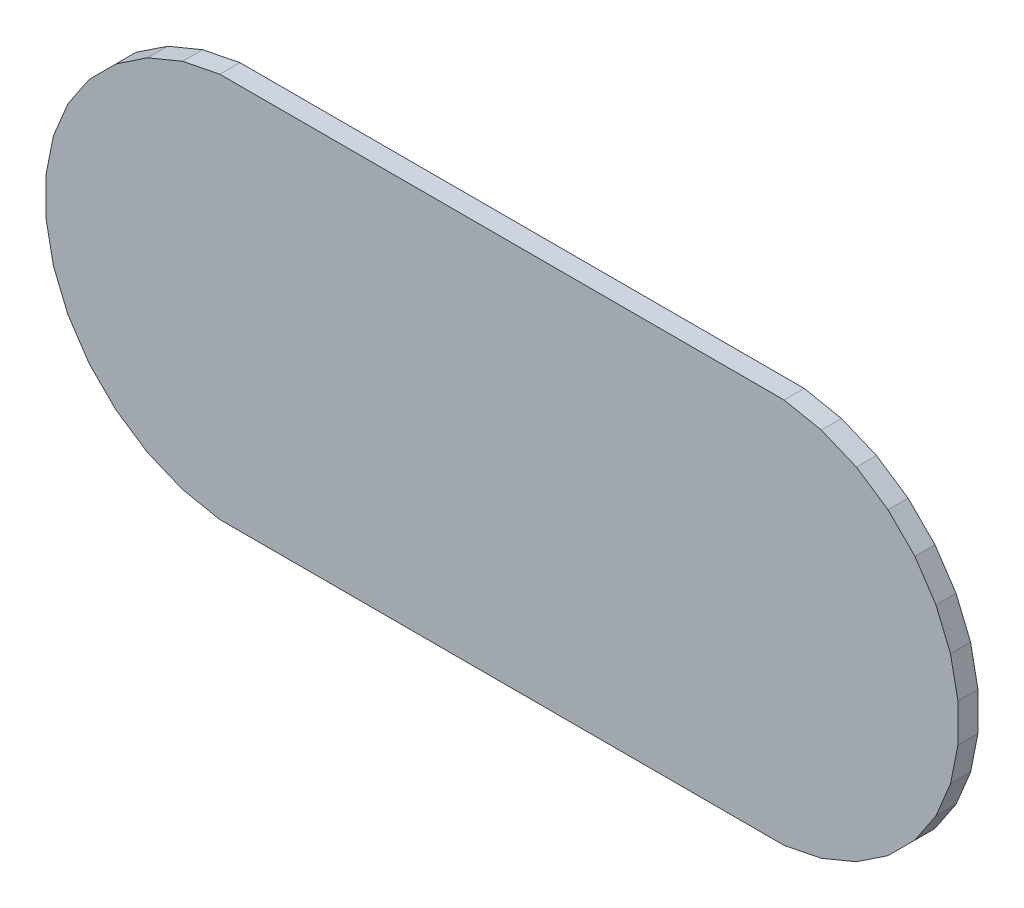
ISO-10303-21;
HEADER;
FILE_DESCRIPTION(('STEP AP214'),'2;1');
FILE_NAME('part.step','',(''),(''),'','','');
FILE_SCHEMA(('AUTOMOTIVE_DESIGN { 1 0 10303 214 1 1 1 1 }'));
ENDSEC;
DATA;
#1=APPLICATION_CONTEXT('core data for automotive mechanical design processes');
#2=APPLICATION_PROTOCOL_DEFINITION('international standard','automotive_design',2000,#1);
#3=PRODUCT_CONTEXT('',#1,'mechanical');
#4=PRODUCT('Part','Part','',(#3));
#5=PRODUCT_RELATED_PRODUCT_CATEGORY('part','',(#4));
#6=PRODUCT_DEFINITION_FORMATION('','',#4);
#7=PRODUCT_DEFINITION_CONTEXT('part definition',#1,'design');
#8=PRODUCT_DEFINITION('design','',#6,#7);
#9=PRODUCT_DEFINITION_SHAPE('','',#8);
#10=(LENGTH_UNIT() NAMED_UNIT(*) SI_UNIT(.MILLI.,.METRE.));
#11=(NAMED_UNIT(*) PLANE_ANGLE_UNIT() SI_UNIT($,.RADIAN.));
#12=(NAMED_UNIT(*) SI_UNIT($,.STERADIAN.) SOLID_ANGLE_UNIT());
#13=UNCERTAINTY_MEASURE_WITH_UNIT(LENGTH_MEASURE(1.E-05),#10,'distance_accuracy_value','');
#14=(GEOMETRIC_REPRESENTATION_CONTEXT(3) GLOBAL_UNCERTAINTY_ASSIGNED_CONTEXT((#13)) GLOBAL_UNIT_ASSIGNED_CONTEXT((#10,
#11,#12)) REPRESENTATION_CONTEXT('',''));
#15=CARTESIAN_POINT('',(0.,0.,0.));
#16=DIRECTION('',(0.,0.,1.));
#17=DIRECTION('',(1.,0.,0.));
#18=AXIS2_PLACEMENT_3D('',#15,#16,#17);
#19=CARTESIAN_POINT('',(-3.2749998,-2.40050828,0.));
#20=DIRECTION('',(0.,0.,1.));
#21=DIRECTION('',(1.,0.,0.));
#22=AXIS2_PLACEMENT_3D('',#19,#20,#21);
#23=PLANE('',#22);
#24=DIRECTION('',(0.980786319847248,-0.195085096305411,0.));
#25=VECTOR('',#24,1.);
#26=CARTESIAN_POINT('',(-3.97520414,-2.30826056,0.));
#27=LINE('',#26,#25);
#28=CARTESIAN_POINT('',(-3.97520414000001,-2.30826056000004,0.));
#29=VERTEX_POINT('',#28);
#30=CARTESIAN_POINT('',(-3.51143062,-2.40050828,0.));
#31=VERTEX_POINT('',#30);
#32=EDGE_CURVE('E274',#29,#31,#27,.T.);
#33=ORIENTED_EDGE('',*,*,#32,.F.);
#34=DIRECTION('',(0.923878103302922,-0.382686882761085,0.));
#35=VECTOR('',#34,1.);
#36=CARTESIAN_POINT('',(-4.4120689,-2.12730334,0.));
#37=LINE('',#36,#35);
#38=CARTESIAN_POINT('',(-4.4120689,-2.12730334000001,0.));
#39=VERTEX_POINT('',#38);
#40=EDGE_CURVE('E272',#39,#29,#37,.T.);
#41=ORIENTED_EDGE('',*,*,#40,.F.);
#42=DIRECTION('',(0.831470533787021,-0.555568853918149,0.));
#43=VECTOR('',#42,1.);
#44=CARTESIAN_POINT('',(-4.8052355,-1.86459876,0.));
#45=LINE('',#44,#43);
#46=CARTESIAN_POINT('',(-4.80523550000001,-1.86459876000001,0.));
#47=VERTEX_POINT('',#46);
#48=EDGE_CURVE('E270',#47,#39,#45,.T.);
#49=ORIENTED_EDGE('',*,*,#48,.F.);
#50=DIRECTION('',(0.707106781186547,-0.707106781186548,0.));
#51=VECTOR('',#50,1.);
#52=CARTESIAN_POINT('',(-5.13959856,-1.5302357,0.));
#53=LINE('',#52,#51);
#54=CARTESIAN_POINT('',(-5.13959856,-1.5302357,0.));
#55=VERTEX_POINT('',#54);
#56=EDGE_CURVE('E268',#55,#47,#53,.T.);
#57=ORIENTED_EDGE('',*,*,#56,.F.);
#58=DIRECTION('',(0.555568853918149,-0.831470533787022,0.));
#59=VECTOR('',#58,1.);
#60=CARTESIAN_POINT('',(-5.40230314,-1.1370691,0.));
#61=LINE('',#60,#59);
#62=CARTESIAN_POINT('',(-5.40230313999999,-1.13706909999999,0.));
#63=VERTEX_POINT('',#62);
#64=EDGE_CURVE('E266',#63,#55,#61,.T.);
#65=ORIENTED_EDGE('',*,*,#64,.F.);
#66=DIRECTION('',(0.382686882761085,-0.923878103302922,0.));
#67=VECTOR('',#66,1.);
#68=CARTESIAN_POINT('',(-5.58326036,-0.70020434,0.));
#69=LINE('',#68,#67);
#70=CARTESIAN_POINT('',(-5.58326035999999,-0.700204339999996,0.));
#71=VERTEX_POINT('',#70);
#72=EDGE_CURVE('E264',#71,#63,#69,.T.);
#73=ORIENTED_EDGE('',*,*,#72,.F.);
#74=DIRECTION('',(0.195085096305412,-0.980786319847248,0.));
#75=VECTOR('',#74,1.);
#76=CARTESIAN_POINT('',(-5.67550808,-0.23643082,0.));
#77=LINE('',#76,#75);
#78=CARTESIAN_POINT('',(-5.67550807999996,-0.236430819999992,0.));
#79=VERTEX_POINT('',#78);
#80=EDGE_CURVE('E262',#79,#71,#77,.T.);
#81=ORIENTED_EDGE('',*,*,#80,.F.);
#82=DIRECTION('',(0.,1.,0.));
#83=VECTOR('',#82,1.);
#84=CARTESIAN_POINT('',(-5.67550808,-2.40050828,0.));
#85=LINE('',#84,#83);
#86=CARTESIAN_POINT('',(-5.67550808,0.236428279999999,0.));
#87=VERTEX_POINT('',#86);
#88=EDGE_CURVE('E260',#87,#79,#85,.F.);
#89=ORIENTED_EDGE('',*,*,#88,.F.);
#90=DIRECTION('',(-0.195085096305412,-0.980786319847248,0.));
#91=VECTOR('',#90,1.);
#92=CARTESIAN_POINT('',(-5.58326036,0.7002018,0.));
#93=LINE('',#92,#91);
#94=CARTESIAN_POINT('',(-5.58326036000004,0.700201800000008,0.));
#95=VERTEX_POINT('',#94);
#96=EDGE_CURVE('E258',#95,#87,#93,.T.);
#97=ORIENTED_EDGE('',*,*,#96,.F.);
#98=DIRECTION('',(-0.382686882761085,-0.923878103302922,0.));
#99=VECTOR('',#98,1.);
#100=CARTESIAN_POINT('',(-5.40230314,1.13706656,0.));
#101=LINE('',#100,#99);
#102=CARTESIAN_POINT('',(-5.40230314000001,1.13706656,0.));
#103=VERTEX_POINT('',#102);
#104=EDGE_CURVE('E256',#103,#95,#101,.T.);
#105=ORIENTED_EDGE('',*,*,#104,.F.);
#106=DIRECTION('',(-0.555568853918149,-0.831470533787022,0.));
#107=VECTOR('',#106,1.);
#108=CARTESIAN_POINT('',(-5.13959856,1.53023316,0.));
#109=LINE('',#108,#107);
#110=CARTESIAN_POINT('',(-5.13959856000001,1.53023316000001,0.));
#111=VERTEX_POINT('',#110);
#112=EDGE_CURVE('E254',#111,#103,#109,.T.);
#113=ORIENTED_EDGE('',*,*,#112,.F.);
#114=DIRECTION('',(-0.707106781186547,-0.707106781186547,0.));
#115=VECTOR('',#114,1.);
#116=CARTESIAN_POINT('',(-4.8052355,1.86459622,0.));
#117=LINE('',#116,#115);
#118=CARTESIAN_POINT('',(-4.8052355,1.86459622,0.));
#119=VERTEX_POINT('',#118);
#120=EDGE_CURVE('E250',#119,#111,#117,.T.);
#121=ORIENTED_EDGE('',*,*,#120,.F.);
#122=DIRECTION('',(-0.831470533787021,-0.555568853918149,0.));
#123=VECTOR('',#122,1.);
#124=CARTESIAN_POINT('',(-4.4120689,2.1273008,0.));
#125=LINE('',#124,#123);
#126=CARTESIAN_POINT('',(-4.41206889999999,2.12730079999999,0.));
#127=VERTEX_POINT('',#126);
#128=EDGE_CURVE('E247',#127,#119,#125,.T.);
#129=ORIENTED_EDGE('',*,*,#128,.F.);
#130=DIRECTION('',(-0.923878103302922,-0.382686882761085,0.));
#131=VECTOR('',#130,1.);
#132=CARTESIAN_POINT('',(-3.97520414,2.30825802,0.));
#133=LINE('',#132,#131);
#134=CARTESIAN_POINT('',(-3.97520414,2.30825801999999,0.));
#135=VERTEX_POINT('',#134);
#136=EDGE_CURVE('E246',#135,#127,#133,.T.);
#137=ORIENTED_EDGE('',*,*,#136,.F.);
#138=DIRECTION('',(-0.980785292053536,-0.195090263446077,0.));
#139=VECTOR('',#138,1.);
#140=CARTESIAN_POINT('',(-3.51143062,2.40050828,0.));
#141=LINE('',#140,#139);
#142=CARTESIAN_POINT('',(-3.51143062,2.40050827999998,0.));
#143=VERTEX_POINT('',#142);
#144=EDGE_CURVE('E20',#143,#135,#141,.T.);
#145=ORIENTED_EDGE('',*,*,#144,.F.);
#146=DIRECTION('',(1.,0.,0.));
#147=VECTOR('',#146,1.);
#148=CARTESIAN_POINT('',(-3.2749998,2.40050828,0.));
#149=LINE('',#148,#147);
#150=CARTESIAN_POINT('',(3.51142808,2.40050828,0.));
#151=VERTEX_POINT('',#150);
#152=EDGE_CURVE('E228',#151,#143,#149,.F.);
#153=ORIENTED_EDGE('',*,*,#152,.F.);
#154=DIRECTION('',(-0.980785292053569,0.195090263445914,0.));
#155=VECTOR('',#154,1.);
#156=CARTESIAN_POINT('',(3.51142808,2.40050828,0.));
#157=LINE('',#156,#155);
#158=CARTESIAN_POINT('',(3.9752016,2.30825802000002,0.));
#159=VERTEX_POINT('',#158);
#160=EDGE_CURVE('E353',#159,#151,#157,.T.);
#161=ORIENTED_EDGE('',*,*,#160,.F.);
#162=DIRECTION('',(-0.923878103302963,0.382686882760985,0.));
#163=VECTOR('',#162,1.);
#164=CARTESIAN_POINT('',(3.9752016,2.30825802,0.));
#165=LINE('',#164,#163);
#166=CARTESIAN_POINT('',(4.41206636,2.12730080000001,0.));
#167=VERTEX_POINT('',#166);
#168=EDGE_CURVE('E348',#167,#159,#165,.T.);
#169=ORIENTED_EDGE('',*,*,#168,.F.);
#170=DIRECTION('',(-0.831470533787084,0.555568853918056,0.));
#171=VECTOR('',#170,1.);
#172=CARTESIAN_POINT('',(4.41206636,2.1273008,0.));
#173=LINE('',#172,#171);
#174=CARTESIAN_POINT('',(4.80523296000001,1.86459622000001,0.));
#175=VERTEX_POINT('',#174);
#176=EDGE_CURVE('E343',#175,#167,#173,.T.);
#177=ORIENTED_EDGE('',*,*,#176,.F.);
#178=DIRECTION('',(-0.707106781186548,0.707106781186548,0.));
#179=VECTOR('',#178,1.);
#180=CARTESIAN_POINT('',(4.80523296,1.86459622,0.));
#181=LINE('',#180,#179);
#182=CARTESIAN_POINT('',(5.13959602,1.53023316,0.));
#183=VERTEX_POINT('',#182);
#184=EDGE_CURVE('E338',#183,#175,#181,.T.);
#185=ORIENTED_EDGE('',*,*,#184,.F.);
#186=DIRECTION('',(-0.555568853918056,0.831470533787084,0.));
#187=VECTOR('',#186,1.);
#188=CARTESIAN_POINT('',(5.13959602,1.53023316,0.));
#189=LINE('',#188,#187);
#190=CARTESIAN_POINT('',(5.40230059999999,1.13706655999999,0.));
#191=VERTEX_POINT('',#190);
#192=EDGE_CURVE('E333',#191,#183,#189,.T.);
#193=ORIENTED_EDGE('',*,*,#192,.F.);
#194=DIRECTION('',(-0.382686882760985,0.923878103302963,0.));
#195=VECTOR('',#194,1.);
#196=CARTESIAN_POINT('',(5.4023006,1.13706656,0.));
#197=LINE('',#196,#195);
#198=CARTESIAN_POINT('',(5.58325781999999,0.700201799999996,0.));
#199=VERTEX_POINT('',#198);
#200=EDGE_CURVE('E328',#199,#191,#197,.T.);
#201=ORIENTED_EDGE('',*,*,#200,.F.);
#202=DIRECTION('',(-0.195090263445914,0.980785292053569,0.));
#203=VECTOR('',#202,1.);
#204=CARTESIAN_POINT('',(5.58325782,0.7002018,0.));
#205=LINE('',#204,#203);
#206=CARTESIAN_POINT('',(5.67550807999998,0.236428279999995,0.));
#207=VERTEX_POINT('',#206);
#208=EDGE_CURVE('E323',#207,#199,#205,.T.);
#209=ORIENTED_EDGE('',*,*,#208,.F.);
#210=DIRECTION('',(0.,1.,0.));
#211=VECTOR('',#210,1.);
#212=CARTESIAN_POINT('',(5.67550808,0.23642828,0.));
#213=LINE('',#212,#211);
#214=CARTESIAN_POINT('',(5.67550808,-0.23643082,0.));
#215=VERTEX_POINT('',#214);
#216=EDGE_CURVE('E318',#215,#207,#213,.T.);
#217=ORIENTED_EDGE('',*,*,#216,.F.);
#218=DIRECTION('',(0.195090263445914,0.980785292053569,0.));
#219=VECTOR('',#218,1.);
#220=CARTESIAN_POINT('',(5.67550808,-0.23643082,0.));
#221=LINE('',#220,#219);
#222=CARTESIAN_POINT('',(5.58325782000002,-0.700204340000004,0.));
#223=VERTEX_POINT('',#222);
#224=EDGE_CURVE('E312',#223,#215,#221,.T.);
#225=ORIENTED_EDGE('',*,*,#224,.F.);
#226=DIRECTION('',(0.382686882760985,0.923878103302963,0.));
#227=VECTOR('',#226,1.);
#228=CARTESIAN_POINT('',(5.58325782,-0.70020434,0.));
#229=LINE('',#228,#227);
#230=CARTESIAN_POINT('',(5.40230060000001,-1.1370691,0.));
#231=VERTEX_POINT('',#230);
#232=EDGE_CURVE('E307',#231,#223,#229,.T.);
#233=ORIENTED_EDGE('',*,*,#232,.F.);
#234=DIRECTION('',(0.555568853918056,0.831470533787084,0.));
#235=VECTOR('',#234,1.);
#236=CARTESIAN_POINT('',(5.4023006,-1.1370691,0.));
#237=LINE('',#236,#235);
#238=CARTESIAN_POINT('',(5.13959602000001,-1.53023570000001,0.));
#239=VERTEX_POINT('',#238);
#240=EDGE_CURVE('E302',#239,#231,#237,.T.);
#241=ORIENTED_EDGE('',*,*,#240,.F.);
#242=DIRECTION('',(0.707106781186548,0.707106781186548,0.));
#243=VECTOR('',#242,1.);
#244=CARTESIAN_POINT('',(5.13959602,-1.5302357,0.));
#245=LINE('',#244,#243);
#246=CARTESIAN_POINT('',(4.80523296,-1.86459876,0.));
#247=VERTEX_POINT('',#246);
#248=EDGE_CURVE('E297',#247,#239,#245,.T.);
#249=ORIENTED_EDGE('',*,*,#248,.F.);
#250=DIRECTION('',(0.831470533787084,0.555568853918056,0.));
#251=VECTOR('',#250,1.);
#252=CARTESIAN_POINT('',(4.80523296,-1.86459876,0.));
#253=LINE('',#252,#251);
#254=CARTESIAN_POINT('',(4.41206635999999,-2.12730333999999,0.));
#255=VERTEX_POINT('',#254);
#256=EDGE_CURVE('E292',#255,#247,#253,.T.);
#257=ORIENTED_EDGE('',*,*,#256,.F.);
#258=DIRECTION('',(0.923878103302963,0.382686882760985,0.));
#259=VECTOR('',#258,1.);
#260=CARTESIAN_POINT('',(4.41206636,-2.12730334,0.));
#261=LINE('',#260,#259);
#262=CARTESIAN_POINT('',(3.9752016,-2.30826055999999,0.));
#263=VERTEX_POINT('',#262);
#264=EDGE_CURVE('E287',#263,#255,#261,.T.);
#265=ORIENTED_EDGE('',*,*,#264,.F.);
#266=DIRECTION('',(0.980786319847317,0.195085096305063,0.));
#267=VECTOR('',#266,1.);
#268=CARTESIAN_POINT('',(3.9752016,-2.30826056,0.));
#269=LINE('',#268,#267);
#270=CARTESIAN_POINT('',(3.51142807999999,-2.40050827999996,0.));
#271=VERTEX_POINT('',#270);
#272=EDGE_CURVE('E282',#271,#263,#269,.T.);
#273=ORIENTED_EDGE('',*,*,#272,.F.);
#274=DIRECTION('',(1.,0.,0.));
#275=VECTOR('',#274,1.);
#276=CARTESIAN_POINT('',(3.51142808,-2.40050828,0.));
#277=LINE('',#276,#275);
#278=EDGE_CURVE('E277',#31,#271,#277,.T.);
#279=ORIENTED_EDGE('',*,*,#278,.F.);
#280=EDGE_LOOP('',(#33,#41,#49,#57,#65,#73,#81,#89,#97,#105,#113,#121,#129,#137,#145,#153,#161,
#169,#177,#185,#193,#201,#209,#217,#225,#233,#241,#249,#257,#265,#273,#279));
#281=FACE_BOUND('',#280,.T.);
#282=ADVANCED_FACE('F17',(#281),#23,.F.);
#283=CARTESIAN_POINT('',(3.9752016,-2.30826056,0.));
#284=DIRECTION('',(0.195085096305063,-0.980786319847317,0.));
#285=DIRECTION('',(0.980786319847317,0.195085096305063,0.));
#286=AXIS2_PLACEMENT_3D('',#283,#284,#285);
#287=PLANE('',#286);
#288=DIRECTION('',(0.,0.,1.));
#289=VECTOR('',#288,1.);
#290=CARTESIAN_POINT('',(3.51142807999997,-2.40050827999984,0.));
#291=LINE('',#290,#289);
#292=CARTESIAN_POINT('',(3.51142807999999,-2.40050827999996,0.2499995));
#293=VERTEX_POINT('',#292);
#294=EDGE_CURVE('E279',#293,#271,#291,.F.);
#295=ORIENTED_EDGE('',*,*,#294,.T.);
#296=ORIENTED_EDGE('',*,*,#272,.T.);
#297=DIRECTION('',(0.,0.,1.));
#298=VECTOR('',#297,1.);
#299=CARTESIAN_POINT('',(3.97520159999998,-2.30826055999995,0.));
#300=LINE('',#299,#298);
#301=CARTESIAN_POINT('',(3.9752016,-2.30826055999999,0.2499995));
#302=VERTEX_POINT('',#301);
#303=EDGE_CURVE('E284',#302,#263,#300,.F.);
#304=ORIENTED_EDGE('',*,*,#303,.F.);
#305=DIRECTION('',(0.980786319847248,0.195085096305411,0.));
#306=VECTOR('',#305,1.);
#307=CARTESIAN_POINT('',(3.51142808,-2.40050828,0.2499995));
#308=LINE('',#307,#306);
#309=EDGE_CURVE('E398',#293,#302,#308,.T.);
#310=ORIENTED_EDGE('',*,*,#309,.F.);
#311=EDGE_LOOP('',(#295,#296,#304,#310));
#312=FACE_BOUND('',#311,.T.);
#313=ADVANCED_FACE('F498',(#312),#287,.T.);
#314=CARTESIAN_POINT('',(4.41206636,-2.12730334,0.));
#315=DIRECTION('',(0.382686882760985,-0.923878103302963,0.));
#316=DIRECTION('',(0.923878103302963,0.382686882760985,0.));
#317=AXIS2_PLACEMENT_3D('',#314,#315,#316);
#318=PLANE('',#317);
#319=ORIENTED_EDGE('',*,*,#303,.T.);
#320=ORIENTED_EDGE('',*,*,#264,.T.);
#321=DIRECTION('',(0.,0.,1.));
#322=VECTOR('',#321,1.);
#323=CARTESIAN_POINT('',(4.41206635999997,-2.12730333999996,0.));
#324=LINE('',#323,#322);
#325=CARTESIAN_POINT('',(4.41206635999999,-2.12730333999999,0.2499995));
#326=VERTEX_POINT('',#325);
#327=EDGE_CURVE('E289',#326,#255,#324,.F.);
#328=ORIENTED_EDGE('',*,*,#327,.F.);
#329=DIRECTION('',(0.923878103302922,0.382686882761085,0.));
#330=VECTOR('',#329,1.);
#331=CARTESIAN_POINT('',(3.9752016,-2.30826056,0.2499995));
#332=LINE('',#331,#330);
#333=EDGE_CURVE('E401',#302,#326,#332,.T.);
#334=ORIENTED_EDGE('',*,*,#333,.F.);
#335=EDGE_LOOP('',(#319,#320,#328,#334));
#336=FACE_BOUND('',#335,.T.);
#337=ADVANCED_FACE('F502',(#336),#318,.T.);
#338=CARTESIAN_POINT('',(4.80523296,-1.86459876,0.));
#339=DIRECTION('',(0.555568853918056,-0.831470533787084,0.));
#340=DIRECTION('',(0.831470533787084,0.555568853918056,0.));
#341=AXIS2_PLACEMENT_3D('',#338,#339,#340);
#342=PLANE('',#341);
#343=ORIENTED_EDGE('',*,*,#327,.T.);
#344=ORIENTED_EDGE('',*,*,#256,.T.);
#345=DIRECTION('',(0.,0.,1.));
#346=VECTOR('',#345,1.);
#347=CARTESIAN_POINT('',(4.80523296,-1.86459876,0.));
#348=LINE('',#347,#346);
#349=CARTESIAN_POINT('',(4.80523296,-1.86459876,0.2499995));
#350=VERTEX_POINT('',#349);
#351=EDGE_CURVE('E294',#350,#247,#348,.F.);
#352=ORIENTED_EDGE('',*,*,#351,.F.);
#353=DIRECTION('',(0.831470533787021,0.555568853918149,0.));
#354=VECTOR('',#353,1.);
#355=CARTESIAN_POINT('',(4.41206636,-2.12730334,0.2499995));
#356=LINE('',#355,#354);
#357=EDGE_CURVE('E404',#326,#350,#356,.T.);
#358=ORIENTED_EDGE('',*,*,#357,.F.);
#359=EDGE_LOOP('',(#343,#344,#352,#358));
#360=FACE_BOUND('',#359,.T.);
#361=ADVANCED_FACE('F504',(#360),#342,.T.);
#362=CARTESIAN_POINT('',(5.13959602,-1.5302357,0.));
#363=DIRECTION('',(0.707106781186548,-0.707106781186548,0.));
#364=DIRECTION('',(0.707106781186548,0.707106781186548,0.));
#365=AXIS2_PLACEMENT_3D('',#362,#363,#364);
#366=PLANE('',#365);
#367=ORIENTED_EDGE('',*,*,#351,.T.);
#368=ORIENTED_EDGE('',*,*,#248,.T.);
#369=DIRECTION('',(0.,0.,1.));
#370=VECTOR('',#369,1.);
#371=CARTESIAN_POINT('',(5.13959602000004,-1.53023570000003,0.));
#372=LINE('',#371,#370);
#373=CARTESIAN_POINT('',(5.13959602000001,-1.53023570000001,0.2499995));
#374=VERTEX_POINT('',#373);
#375=EDGE_CURVE('E299',#374,#239,#372,.F.);
#376=ORIENTED_EDGE('',*,*,#375,.F.);
#377=DIRECTION('',(0.707106781186546,0.707106781186549,0.));
#378=VECTOR('',#377,1.);
#379=CARTESIAN_POINT('',(4.80523296,-1.86459876,0.2499995));
#380=LINE('',#379,#378);
#381=EDGE_CURVE('E407',#350,#374,#380,.T.);
#382=ORIENTED_EDGE('',*,*,#381,.F.);
#383=EDGE_LOOP('',(#367,#368,#376,#382));
#384=FACE_BOUND('',#383,.T.);
#385=ADVANCED_FACE('F508',(#384),#366,.T.);
#386=CARTESIAN_POINT('',(5.4023006,-1.1370691,0.));
#387=DIRECTION('',(0.831470533787084,-0.555568853918056,0.));
#388=DIRECTION('',(0.555568853918056,0.831470533787084,0.));
#389=AXIS2_PLACEMENT_3D('',#386,#387,#388);
#390=PLANE('',#389);
#391=ORIENTED_EDGE('',*,*,#375,.T.);
#392=ORIENTED_EDGE('',*,*,#240,.T.);
#393=DIRECTION('',(0.,0.,1.));
#394=VECTOR('',#393,1.);
#395=CARTESIAN_POINT('',(5.40230060000005,-1.13706910000002,0.));
#396=LINE('',#395,#394);
#397=CARTESIAN_POINT('',(5.40230060000001,-1.1370691,0.2499995));
#398=VERTEX_POINT('',#397);
#399=EDGE_CURVE('E304',#398,#231,#396,.F.);
#400=ORIENTED_EDGE('',*,*,#399,.F.);
#401=DIRECTION('',(0.555568853918152,0.83147053378702,0.));
#402=VECTOR('',#401,1.);
#403=CARTESIAN_POINT('',(5.13959602,-1.5302357,0.2499995));
#404=LINE('',#403,#402);
#405=EDGE_CURVE('E410',#374,#398,#404,.T.);
#406=ORIENTED_EDGE('',*,*,#405,.F.);
#407=EDGE_LOOP('',(#391,#392,#400,#406));
#408=FACE_BOUND('',#407,.T.);
#409=ADVANCED_FACE('F512',(#408),#390,.T.);
#410=CARTESIAN_POINT('',(5.58325782,-0.70020434,0.));
#411=DIRECTION('',(0.923878103302963,-0.382686882760985,0.));
#412=DIRECTION('',(0.382686882760985,0.923878103302963,0.));
#413=AXIS2_PLACEMENT_3D('',#410,#411,#412);
#414=PLANE('',#413);
#415=ORIENTED_EDGE('',*,*,#399,.T.);
#416=ORIENTED_EDGE('',*,*,#232,.T.);
#417=DIRECTION('',(0.,0.,1.));
#418=VECTOR('',#417,1.);
#419=CARTESIAN_POINT('',(5.58325782000008,-0.700204340000015,0.));
#420=LINE('',#419,#418);
#421=CARTESIAN_POINT('',(5.58325782000002,-0.700204340000004,0.2499995));
#422=VERTEX_POINT('',#421);
#423=EDGE_CURVE('E309',#422,#223,#420,.F.);
#424=ORIENTED_EDGE('',*,*,#423,.F.);
#425=DIRECTION('',(0.382686882761085,0.923878103302922,0.));
#426=VECTOR('',#425,1.);
#427=CARTESIAN_POINT('',(5.4023006,-1.1370691,0.2499995));
#428=LINE('',#427,#426);
#429=EDGE_CURVE('E413',#398,#422,#428,.T.);
#430=ORIENTED_EDGE('',*,*,#429,.F.);
#431=EDGE_LOOP('',(#415,#416,#424,#430));
#432=FACE_BOUND('',#431,.T.);
#433=ADVANCED_FACE('F516',(#432),#414,.T.);
#434=CARTESIAN_POINT('',(5.67550808,-0.23643082,0.));
#435=DIRECTION('',(0.980785292053569,-0.195090263445914,0.));
#436=DIRECTION('',(0.195090263445914,0.980785292053569,0.));
#437=AXIS2_PLACEMENT_3D('',#434,#435,#436);
#438=PLANE('',#437);
#439=ORIENTED_EDGE('',*,*,#423,.T.);
#440=ORIENTED_EDGE('',*,*,#224,.T.);
#441=DIRECTION('',(0.,0.,-1.));
#442=VECTOR('',#441,1.);
#443=CARTESIAN_POINT('',(5.67550808,-0.23643082,0.));
#444=LINE('',#443,#442);
#445=CARTESIAN_POINT('',(5.67550808,-0.23643082,0.2499995));
#446=VERTEX_POINT('',#445);
#447=EDGE_CURVE('E315',#446,#215,#444,.T.);
#448=ORIENTED_EDGE('',*,*,#447,.F.);
#449=DIRECTION('',(0.195090263446076,0.980785292053536,0.));
#450=VECTOR('',#449,1.);
#451=CARTESIAN_POINT('',(5.58325782,-0.70020434,0.2499995));
#452=LINE('',#451,#450);
#453=EDGE_CURVE('E416',#422,#446,#452,.T.);
#454=ORIENTED_EDGE('',*,*,#453,.F.);
#455=EDGE_LOOP('',(#439,#440,#448,#454));
#456=FACE_BOUND('',#455,.T.);
#457=ADVANCED_FACE('F520',(#456),#438,.T.);
#458=CARTESIAN_POINT('',(5.67550808,0.23642828,0.));
#459=DIRECTION('',(1.,0.,0.));
#460=DIRECTION('',(0.,0.,-1.));
#461=AXIS2_PLACEMENT_3D('',#458,#459,#460);
#462=PLANE('',#461);
#463=DIRECTION('',(0.,0.,1.));
#464=VECTOR('',#463,1.);
#465=CARTESIAN_POINT('',(5.67550807999992,0.236428279999985,0.));
#466=LINE('',#465,#464);
#467=CARTESIAN_POINT('',(5.67550807999998,0.236428279999995,0.2499995));
#468=VERTEX_POINT('',#467);
#469=EDGE_CURVE('E320',#468,#207,#466,.F.);
#470=ORIENTED_EDGE('',*,*,#469,.F.);
#471=DIRECTION('',(0.,1.,0.));
#472=VECTOR('',#471,1.);
#473=CARTESIAN_POINT('',(5.67550808,-2.40050828,0.2499995));
#474=LINE('',#473,#472);
#475=EDGE_CURVE('E419',#446,#468,#474,.T.);
#476=ORIENTED_EDGE('',*,*,#475,.F.);
#477=ORIENTED_EDGE('',*,*,#447,.T.);
#478=ORIENTED_EDGE('',*,*,#216,.T.);
#479=EDGE_LOOP('',(#470,#476,#477,#478));
#480=FACE_BOUND('',#479,.T.);
#481=ADVANCED_FACE('F525',(#480),#462,.T.);
#482=CARTESIAN_POINT('',(5.58325782,0.7002018,0.));
#483=DIRECTION('',(0.980785292053569,0.195090263445914,0.));
#484=DIRECTION('',(-0.195090263445914,0.980785292053569,0.));
#485=AXIS2_PLACEMENT_3D('',#482,#483,#484);
#486=PLANE('',#485);
#487=ORIENTED_EDGE('',*,*,#469,.T.);
#488=ORIENTED_EDGE('',*,*,#208,.T.);
#489=DIRECTION('',(0.,0.,1.));
#490=VECTOR('',#489,1.);
#491=CARTESIAN_POINT('',(5.58325781999995,0.70020179999998,0.));
#492=LINE('',#491,#490);
#493=CARTESIAN_POINT('',(5.58325781999999,0.700201799999996,0.2499995));
#494=VERTEX_POINT('',#493);
#495=EDGE_CURVE('E325',#494,#199,#492,.F.);
#496=ORIENTED_EDGE('',*,*,#495,.F.);
#497=DIRECTION('',(-0.195090263446076,0.980785292053536,0.));
#498=VECTOR('',#497,1.);
#499=CARTESIAN_POINT('',(5.67550808,0.23642828,0.2499995));
#500=LINE('',#499,#498);
#501=EDGE_CURVE('E421',#468,#494,#500,.T.);
#502=ORIENTED_EDGE('',*,*,#501,.F.);
#503=EDGE_LOOP('',(#487,#488,#496,#502));
#504=FACE_BOUND('',#503,.T.);
#505=ADVANCED_FACE('F528',(#504),#486,.T.);
#506=CARTESIAN_POINT('',(5.4023006,1.13706656,0.));
#507=DIRECTION('',(0.923878103302963,0.382686882760985,0.));
#508=DIRECTION('',(-0.382686882760985,0.923878103302963,0.));
#509=AXIS2_PLACEMENT_3D('',#506,#507,#508);
#510=PLANE('',#509);
#511=ORIENTED_EDGE('',*,*,#495,.T.);
#512=ORIENTED_EDGE('',*,*,#200,.T.);
#513=DIRECTION('',(0.,0.,1.));
#514=VECTOR('',#513,1.);
#515=CARTESIAN_POINT('',(5.40230059999996,1.13706655999997,0.));
#516=LINE('',#515,#514);
#517=CARTESIAN_POINT('',(5.40230059999999,1.13706655999999,0.2499995));
#518=VERTEX_POINT('',#517);
#519=EDGE_CURVE('E330',#518,#191,#516,.F.);
#520=ORIENTED_EDGE('',*,*,#519,.F.);
#521=DIRECTION('',(-0.382686882761085,0.923878103302922,0.));
#522=VECTOR('',#521,1.);
#523=CARTESIAN_POINT('',(5.58325782,0.7002018,0.2499995));
#524=LINE('',#523,#522);
#525=EDGE_CURVE('E424',#494,#518,#524,.T.);
#526=ORIENTED_EDGE('',*,*,#525,.F.);
#527=EDGE_LOOP('',(#511,#512,#520,#526));
#528=FACE_BOUND('',#527,.T.);
#529=ADVANCED_FACE('F532',(#528),#510,.T.);
#530=CARTESIAN_POINT('',(5.13959602,1.53023316,0.));
#531=DIRECTION('',(0.831470533787084,0.555568853918056,0.));
#532=DIRECTION('',(-0.555568853918056,0.831470533787084,0.));
#533=AXIS2_PLACEMENT_3D('',#530,#531,#532);
#534=PLANE('',#533);
#535=ORIENTED_EDGE('',*,*,#519,.T.);
#536=ORIENTED_EDGE('',*,*,#192,.T.);
#537=DIRECTION('',(0.,0.,1.));
#538=VECTOR('',#537,1.);
#539=CARTESIAN_POINT('',(5.13959602,1.53023316,0.));
#540=LINE('',#539,#538);
#541=CARTESIAN_POINT('',(5.13959602,1.53023316,0.2499995));
#542=VERTEX_POINT('',#541);
#543=EDGE_CURVE('E335',#542,#183,#540,.F.);
#544=ORIENTED_EDGE('',*,*,#543,.F.);
#545=DIRECTION('',(-0.555568853918151,0.83147053378702,0.));
#546=VECTOR('',#545,1.);
#547=CARTESIAN_POINT('',(5.4023006,1.13706656,0.2499995));
#548=LINE('',#547,#546);
#549=EDGE_CURVE('E427',#518,#542,#548,.T.);
#550=ORIENTED_EDGE('',*,*,#549,.F.);
#551=EDGE_LOOP('',(#535,#536,#544,#550));
#552=FACE_BOUND('',#551,.T.);
#553=ADVANCED_FACE('F536',(#552),#534,.T.);
#554=CARTESIAN_POINT('',(4.80523296,1.86459622,0.));
#555=DIRECTION('',(0.707106781186548,0.707106781186548,0.));
#556=DIRECTION('',(-0.707106781186548,0.707106781186548,0.));
#557=AXIS2_PLACEMENT_3D('',#554,#555,#556);
#558=PLANE('',#557);
#559=ORIENTED_EDGE('',*,*,#543,.T.);
#560=ORIENTED_EDGE('',*,*,#184,.T.);
#561=DIRECTION('',(0.,0.,1.));
#562=VECTOR('',#561,1.);
#563=CARTESIAN_POINT('',(4.80523296000003,1.86459622000004,0.));
#564=LINE('',#563,#562);
#565=CARTESIAN_POINT('',(4.80523296000001,1.86459622000001,0.2499995));
#566=VERTEX_POINT('',#565);
#567=EDGE_CURVE('E340',#566,#175,#564,.F.);
#568=ORIENTED_EDGE('',*,*,#567,.F.);
#569=DIRECTION('',(-0.707106781186547,0.707106781186548,0.));
#570=VECTOR('',#569,1.);
#571=CARTESIAN_POINT('',(5.13959602,1.53023316,0.2499995));
#572=LINE('',#571,#570);
#573=EDGE_CURVE('E430',#542,#566,#572,.T.);
#574=ORIENTED_EDGE('',*,*,#573,.F.);
#575=EDGE_LOOP('',(#559,#560,#568,#574));
#576=FACE_BOUND('',#575,.T.);
#577=ADVANCED_FACE('F540',(#576),#558,.T.);
#578=CARTESIAN_POINT('',(4.41206636,2.1273008,0.));
#579=DIRECTION('',(0.555568853918056,0.831470533787084,0.));
#580=DIRECTION('',(-0.831470533787084,0.555568853918056,0.));
#581=AXIS2_PLACEMENT_3D('',#578,#579,#580);
#582=PLANE('',#581);
#583=ORIENTED_EDGE('',*,*,#567,.T.);
#584=ORIENTED_EDGE('',*,*,#176,.T.);
#585=DIRECTION('',(0.,0.,1.));
#586=VECTOR('',#585,1.);
#587=CARTESIAN_POINT('',(4.41206636000002,2.12730080000005,0.));
#588=LINE('',#587,#586);
#589=CARTESIAN_POINT('',(4.41206636,2.12730080000001,0.2499995));
#590=VERTEX_POINT('',#589);
#591=EDGE_CURVE('E345',#590,#167,#588,.F.);
#592=ORIENTED_EDGE('',*,*,#591,.F.);
#593=DIRECTION('',(-0.831470533787021,0.555568853918149,0.));
#594=VECTOR('',#593,1.);
#595=CARTESIAN_POINT('',(4.80523296,1.86459622,0.2499995));
#596=LINE('',#595,#594);
#597=EDGE_CURVE('E433',#566,#590,#596,.T.);
#598=ORIENTED_EDGE('',*,*,#597,.F.);
#599=EDGE_LOOP('',(#583,#584,#592,#598));
#600=FACE_BOUND('',#599,.T.);
#601=ADVANCED_FACE('F544',(#600),#582,.T.);
#602=CARTESIAN_POINT('',(3.9752016,2.30825802,0.));
#603=DIRECTION('',(0.382686882760985,0.923878103302963,0.));
#604=DIRECTION('',(-0.923878103302963,0.382686882760985,0.));
#605=AXIS2_PLACEMENT_3D('',#602,#603,#604);
#606=PLANE('',#605);
#607=ORIENTED_EDGE('',*,*,#591,.T.);
#608=ORIENTED_EDGE('',*,*,#168,.T.);
#609=DIRECTION('',(0.,0.,1.));
#610=VECTOR('',#609,1.);
#611=CARTESIAN_POINT('',(3.97520160000002,2.30825802000008,0.));
#612=LINE('',#611,#610);
#613=CARTESIAN_POINT('',(3.9752016,2.30825802000002,0.2499995));
#614=VERTEX_POINT('',#613);
#615=EDGE_CURVE('E350',#614,#159,#612,.F.);
#616=ORIENTED_EDGE('',*,*,#615,.F.);
#617=DIRECTION('',(-0.923878103302922,0.382686882761085,0.));
#618=VECTOR('',#617,1.);
#619=CARTESIAN_POINT('',(4.41206636,2.1273008,0.2499995));
#620=LINE('',#619,#618);
#621=EDGE_CURVE('E436',#590,#614,#620,.T.);
#622=ORIENTED_EDGE('',*,*,#621,.F.);
#623=EDGE_LOOP('',(#607,#608,#616,#622));
#624=FACE_BOUND('',#623,.T.);
#625=ADVANCED_FACE('F548',(#624),#606,.T.);
#626=CARTESIAN_POINT('',(3.51142808,2.40050828,0.));
#627=DIRECTION('',(0.195090263445914,0.980785292053569,0.));
#628=DIRECTION('',(-0.980785292053569,0.195090263445914,0.));
#629=AXIS2_PLACEMENT_3D('',#626,#627,#628);
#630=PLANE('',#629);
#631=ORIENTED_EDGE('',*,*,#615,.T.);
#632=ORIENTED_EDGE('',*,*,#160,.T.);
#633=DIRECTION('',(0.,0.,1.));
#634=VECTOR('',#633,1.);
#635=CARTESIAN_POINT('',(3.51142808,2.40050828,0.));
#636=LINE('',#635,#634);
#637=CARTESIAN_POINT('',(3.51142808,2.40050828,0.2499995));
#638=VERTEX_POINT('',#637);
#639=EDGE_CURVE('E233',#638,#151,#636,.F.);
#640=ORIENTED_EDGE('',*,*,#639,.F.);
#641=DIRECTION('',(-0.980785292053536,0.195090263446078,0.));
#642=VECTOR('',#641,1.);
#643=CARTESIAN_POINT('',(3.9752016,2.30825802,0.2499995));
#644=LINE('',#643,#642);
#645=EDGE_CURVE('E439',#614,#638,#644,.T.);
#646=ORIENTED_EDGE('',*,*,#645,.F.);
#647=EDGE_LOOP('',(#631,#632,#640,#646));
#648=FACE_BOUND('',#647,.T.);
#649=ADVANCED_FACE('F551',(#648),#630,.T.);
#650=CARTESIAN_POINT('',(-3.51143062,2.40050828,0.));
#651=DIRECTION('',(0.,1.,0.));
#652=DIRECTION('',(0.,0.,1.));
#653=AXIS2_PLACEMENT_3D('',#650,#651,#652);
#654=PLANE('',#653);
#655=DIRECTION('',(0.,0.,1.));
#656=VECTOR('',#655,1.);
#657=CARTESIAN_POINT('',(-3.51143061999998,2.40050827999992,0.));
#658=LINE('',#657,#656);
#659=CARTESIAN_POINT('',(-3.51143062,2.40050827999998,0.2499995));
#660=VERTEX_POINT('',#659);
#661=EDGE_CURVE('E231',#660,#143,#658,.F.);
#662=ORIENTED_EDGE('',*,*,#661,.F.);
#663=DIRECTION('',(1.,0.,0.));
#664=VECTOR('',#663,1.);
#665=CARTESIAN_POINT('',(-3.2749998,2.40050828,0.2499995));
#666=LINE('',#665,#664);
#667=EDGE_CURVE('E442',#638,#660,#666,.F.);
#668=ORIENTED_EDGE('',*,*,#667,.F.);
#669=ORIENTED_EDGE('',*,*,#639,.T.);
#670=ORIENTED_EDGE('',*,*,#152,.T.);
#671=EDGE_LOOP('',(#662,#668,#669,#670));
#672=FACE_BOUND('',#671,.T.);
#673=ADVANCED_FACE('F229',(#672),#654,.T.);
#674=CARTESIAN_POINT('',(-3.97520414,2.30825802,0.));
#675=DIRECTION('',(-0.195090263445914,0.980785292053569,0.));
#676=DIRECTION('',(-0.980785292053569,-0.195090263445914,0.));
#677=AXIS2_PLACEMENT_3D('',#674,#675,#676);
#678=PLANE('',#677);
#679=ORIENTED_EDGE('',*,*,#661,.T.);
#680=ORIENTED_EDGE('',*,*,#144,.T.);
#681=DIRECTION('',(0.,0.,1.));
#682=VECTOR('',#681,1.);
#683=CARTESIAN_POINT('',(-3.97520413999998,2.30825801999995,0.));
#684=LINE('',#683,#682);
#685=CARTESIAN_POINT('',(-3.97520414,2.30825801999999,0.2499995));
#686=VERTEX_POINT('',#685);
#687=EDGE_CURVE('E241',#686,#135,#684,.F.);
#688=ORIENTED_EDGE('',*,*,#687,.F.);
#689=DIRECTION('',(-0.980785292053536,-0.195090263446077,0.));
#690=VECTOR('',#689,1.);
#691=CARTESIAN_POINT('',(-3.51143062,2.40050828,0.2499995));
#692=LINE('',#691,#690);
#693=EDGE_CURVE('E240',#660,#686,#692,.T.);
#694=ORIENTED_EDGE('',*,*,#693,.F.);
#695=EDGE_LOOP('',(#679,#680,#688,#694));
#696=FACE_BOUND('',#695,.T.);
#697=ADVANCED_FACE('F238',(#696),#678,.T.);
#698=CARTESIAN_POINT('',(-4.4120689,2.1273008,0.));
#699=DIRECTION('',(-0.382686882760985,0.923878103302963,0.));
#700=DIRECTION('',(-0.923878103302963,-0.382686882760985,0.));
#701=AXIS2_PLACEMENT_3D('',#698,#699,#700);
#702=PLANE('',#701);
#703=ORIENTED_EDGE('',*,*,#687,.T.);
#704=ORIENTED_EDGE('',*,*,#136,.T.);
#705=DIRECTION('',(0.,0.,1.));
#706=VECTOR('',#705,1.);
#707=CARTESIAN_POINT('',(-4.41206889999997,2.12730079999996,0.));
#708=LINE('',#707,#706);
#709=CARTESIAN_POINT('',(-4.41206889999999,2.12730079999999,0.2499995));
#710=VERTEX_POINT('',#709);
#711=EDGE_CURVE('E357',#710,#127,#708,.F.);
#712=ORIENTED_EDGE('',*,*,#711,.F.);
#713=DIRECTION('',(-0.923878103302922,-0.382686882761085,0.));
#714=VECTOR('',#713,1.);
#715=CARTESIAN_POINT('',(-3.97520414,2.30825802,0.2499995));
#716=LINE('',#715,#714);
#717=EDGE_CURVE('E445',#686,#710,#716,.T.);
#718=ORIENTED_EDGE('',*,*,#717,.F.);
#719=EDGE_LOOP('',(#703,#704,#712,#718));
#720=FACE_BOUND('',#719,.T.);
#721=ADVANCED_FACE('F554',(#720),#702,.T.);
#722=CARTESIAN_POINT('',(-4.8052355,1.86459622,0.));
#723=DIRECTION('',(-0.555568853918056,0.831470533787084,0.));
#724=DIRECTION('',(-0.831470533787084,-0.555568853918056,0.));
#725=AXIS2_PLACEMENT_3D('',#722,#723,#724);
#726=PLANE('',#725);
#727=ORIENTED_EDGE('',*,*,#711,.T.);
#728=ORIENTED_EDGE('',*,*,#128,.T.);
#729=DIRECTION('',(0.,0.,1.));
#730=VECTOR('',#729,1.);
#731=CARTESIAN_POINT('',(-4.8052355,1.86459622,0.));
#732=LINE('',#731,#730);
#733=CARTESIAN_POINT('',(-4.8052355,1.86459622,0.2499995));
#734=VERTEX_POINT('',#733);
#735=EDGE_CURVE('E359',#734,#119,#732,.F.);
#736=ORIENTED_EDGE('',*,*,#735,.F.);
#737=DIRECTION('',(-0.831470533787021,-0.555568853918149,0.));
#738=VECTOR('',#737,1.);
#739=CARTESIAN_POINT('',(-4.4120689,2.1273008,0.2499995));
#740=LINE('',#739,#738);
#741=EDGE_CURVE('E448',#710,#734,#740,.T.);
#742=ORIENTED_EDGE('',*,*,#741,.F.);
#743=EDGE_LOOP('',(#727,#728,#736,#742));
#744=FACE_BOUND('',#743,.T.);
#745=ADVANCED_FACE('F556',(#744),#726,.T.);
#746=CARTESIAN_POINT('',(-5.13959856,1.53023316,0.));
#747=DIRECTION('',(-0.707106781186548,0.707106781186548,0.));
#748=DIRECTION('',(-0.707106781186548,-0.707106781186548,0.));
#749=AXIS2_PLACEMENT_3D('',#746,#747,#748);
#750=PLANE('',#749);
#751=ORIENTED_EDGE('',*,*,#735,.T.);
#752=ORIENTED_EDGE('',*,*,#120,.T.);
#753=DIRECTION('',(0.,0.,1.));
#754=VECTOR('',#753,1.);
#755=CARTESIAN_POINT('',(-5.13959856000004,1.53023316000003,0.));
#756=LINE('',#755,#754);
#757=CARTESIAN_POINT('',(-5.13959856000001,1.53023316000001,0.2499995));
#758=VERTEX_POINT('',#757);
#759=EDGE_CURVE('E362',#758,#111,#756,.F.);
#760=ORIENTED_EDGE('',*,*,#759,.F.);
#761=DIRECTION('',(-0.707106781186547,-0.707106781186547,0.));
#762=VECTOR('',#761,1.);
#763=CARTESIAN_POINT('',(-4.8052355,1.86459622,0.2499995));
#764=LINE('',#763,#762);
#765=EDGE_CURVE('E451',#734,#758,#764,.T.);
#766=ORIENTED_EDGE('',*,*,#765,.F.);
#767=EDGE_LOOP('',(#751,#752,#760,#766));
#768=FACE_BOUND('',#767,.T.);
#769=ADVANCED_FACE('F560',(#768),#750,.T.);
#770=CARTESIAN_POINT('',(-5.40230314,1.13706656,0.));
#771=DIRECTION('',(-0.831470533787084,0.555568853918056,0.));
#772=DIRECTION('',(-0.555568853918056,-0.831470533787084,0.));
#773=AXIS2_PLACEMENT_3D('',#770,#771,#772);
#774=PLANE('',#773);
#775=ORIENTED_EDGE('',*,*,#759,.T.);
#776=ORIENTED_EDGE('',*,*,#112,.T.);
#777=DIRECTION('',(0.,0.,1.));
#778=VECTOR('',#777,1.);
#779=CARTESIAN_POINT('',(-5.40230314000005,1.13706656000002,0.));
#780=LINE('',#779,#778);
#781=CARTESIAN_POINT('',(-5.40230314000001,1.13706656,0.2499995));
#782=VERTEX_POINT('',#781);
#783=EDGE_CURVE('E365',#782,#103,#780,.F.);
#784=ORIENTED_EDGE('',*,*,#783,.F.);
#785=DIRECTION('',(-0.555568853918149,-0.831470533787022,0.));
#786=VECTOR('',#785,1.);
#787=CARTESIAN_POINT('',(-5.13959856,1.53023316,0.2499995));
#788=LINE('',#787,#786);
#789=EDGE_CURVE('E454',#758,#782,#788,.T.);
#790=ORIENTED_EDGE('',*,*,#789,.F.);
#791=EDGE_LOOP('',(#775,#776,#784,#790));
#792=FACE_BOUND('',#791,.T.);
#793=ADVANCED_FACE('F564',(#792),#774,.T.);
#794=CARTESIAN_POINT('',(-5.58326036,0.7002018,0.));
#795=DIRECTION('',(-0.923878103302963,0.382686882760985,0.));
#796=DIRECTION('',(-0.382686882760985,-0.923878103302963,0.));
#797=AXIS2_PLACEMENT_3D('',#794,#795,#796);
#798=PLANE('',#797);
#799=ORIENTED_EDGE('',*,*,#783,.T.);
#800=ORIENTED_EDGE('',*,*,#104,.T.);
#801=DIRECTION('',(0.,0.,1.));
#802=VECTOR('',#801,1.);
#803=CARTESIAN_POINT('',(-5.58326036000016,0.700201800000033,0.));
#804=LINE('',#803,#802);
#805=CARTESIAN_POINT('',(-5.58326036000004,0.700201800000008,0.2499995));
#806=VERTEX_POINT('',#805);
#807=EDGE_CURVE('E368',#806,#95,#804,.F.);
#808=ORIENTED_EDGE('',*,*,#807,.F.);
#809=DIRECTION('',(-0.382686882761085,-0.923878103302922,0.));
#810=VECTOR('',#809,1.);
#811=CARTESIAN_POINT('',(-5.40230314,1.13706656,0.2499995));
#812=LINE('',#811,#810);
#813=EDGE_CURVE('E457',#782,#806,#812,.T.);
#814=ORIENTED_EDGE('',*,*,#813,.F.);
#815=EDGE_LOOP('',(#799,#800,#808,#814));
#816=FACE_BOUND('',#815,.T.);
#817=ADVANCED_FACE('F568',(#816),#798,.T.);
#818=CARTESIAN_POINT('',(-5.67550808,0.23642828,0.));
#819=DIRECTION('',(-0.980786319847317,0.195085096305063,0.));
#820=DIRECTION('',(-0.195085096305063,-0.980786319847317,0.));
#821=AXIS2_PLACEMENT_3D('',#818,#819,#820);
#822=PLANE('',#821);
#823=ORIENTED_EDGE('',*,*,#807,.T.);
#824=ORIENTED_EDGE('',*,*,#96,.T.);
#825=DIRECTION('',(0.,0.,1.));
#826=VECTOR('',#825,1.);
#827=CARTESIAN_POINT('',(-5.67550808,0.23642828,0.));
#828=LINE('',#827,#826);
#829=CARTESIAN_POINT('',(-5.67550808,0.236428279999999,0.2499995));
#830=VERTEX_POINT('',#829);
#831=EDGE_CURVE('E371',#830,#87,#828,.F.);
#832=ORIENTED_EDGE('',*,*,#831,.F.);
#833=DIRECTION('',(-0.195085096305412,-0.980786319847248,0.));
#834=VECTOR('',#833,1.);
#835=CARTESIAN_POINT('',(-5.58326036,0.7002018,0.2499995));
#836=LINE('',#835,#834);
#837=EDGE_CURVE('E460',#806,#830,#836,.T.);
#838=ORIENTED_EDGE('',*,*,#837,.F.);
#839=EDGE_LOOP('',(#823,#824,#832,#838));
#840=FACE_BOUND('',#839,.T.);
#841=ADVANCED_FACE('F572',(#840),#822,.T.);
#842=CARTESIAN_POINT('',(-5.67550808,-0.23643082,0.));
#843=DIRECTION('',(-1.,0.,0.));
#844=DIRECTION('',(0.,0.,1.));
#845=AXIS2_PLACEMENT_3D('',#842,#843,#844);
#846=PLANE('',#845);
#847=ORIENTED_EDGE('',*,*,#831,.T.);
#848=ORIENTED_EDGE('',*,*,#88,.T.);
#849=DIRECTION('',(0.,0.,1.));
#850=VECTOR('',#849,1.);
#851=CARTESIAN_POINT('',(-5.67550807999984,-0.236430819999967,0.));
#852=LINE('',#851,#850);
#853=CARTESIAN_POINT('',(-5.67550807999996,-0.236430819999992,0.2499995));
#854=VERTEX_POINT('',#853);
#855=EDGE_CURVE('E374',#854,#79,#852,.F.);
#856=ORIENTED_EDGE('',*,*,#855,.F.);
#857=DIRECTION('',(0.,1.,0.));
#858=VECTOR('',#857,1.);
#859=CARTESIAN_POINT('',(-5.67550808,-2.40050828,0.2499995));
#860=LINE('',#859,#858);
#861=EDGE_CURVE('E463',#830,#854,#860,.F.);
#862=ORIENTED_EDGE('',*,*,#861,.F.);
#863=EDGE_LOOP('',(#847,#848,#856,#862));
#864=FACE_BOUND('',#863,.T.);
#865=ADVANCED_FACE('F576',(#864),#846,.T.);
#866=CARTESIAN_POINT('',(-5.58326036,-0.70020434,0.));
#867=DIRECTION('',(-0.980786319847317,-0.195085096305063,0.));
#868=DIRECTION('',(0.195085096305063,-0.980786319847317,0.));
#869=AXIS2_PLACEMENT_3D('',#866,#867,#868);
#870=PLANE('',#869);
#871=ORIENTED_EDGE('',*,*,#855,.T.);
#872=ORIENTED_EDGE('',*,*,#80,.T.);
#873=DIRECTION('',(0.,0.,1.));
#874=VECTOR('',#873,1.);
#875=CARTESIAN_POINT('',(-5.58326035999995,-0.70020433999998,0.));
#876=LINE('',#875,#874);
#877=CARTESIAN_POINT('',(-5.58326035999999,-0.700204339999996,0.2499995));
#878=VERTEX_POINT('',#877);
#879=EDGE_CURVE('E377',#878,#71,#876,.F.);
#880=ORIENTED_EDGE('',*,*,#879,.F.);
#881=DIRECTION('',(0.195085096305412,-0.980786319847248,0.));
#882=VECTOR('',#881,1.);
#883=CARTESIAN_POINT('',(-5.67550808,-0.23643082,0.2499995));
#884=LINE('',#883,#882);
#885=EDGE_CURVE('E466',#854,#878,#884,.T.);
#886=ORIENTED_EDGE('',*,*,#885,.F.);
#887=EDGE_LOOP('',(#871,#872,#880,#886));
#888=FACE_BOUND('',#887,.T.);
#889=ADVANCED_FACE('F580',(#888),#870,.T.);
#890=CARTESIAN_POINT('',(-5.40230314,-1.1370691,0.));
#891=DIRECTION('',(-0.923878103302963,-0.382686882760985,0.));
#892=DIRECTION('',(0.382686882760985,-0.923878103302963,0.));
#893=AXIS2_PLACEMENT_3D('',#890,#891,#892);
#894=PLANE('',#893);
#895=ORIENTED_EDGE('',*,*,#879,.T.);
#896=ORIENTED_EDGE('',*,*,#72,.T.);
#897=DIRECTION('',(0.,0.,1.));
#898=VECTOR('',#897,1.);
#899=CARTESIAN_POINT('',(-5.40230313999996,-1.13706909999997,0.));
#900=LINE('',#899,#898);
#901=CARTESIAN_POINT('',(-5.40230313999999,-1.13706909999999,0.2499995));
#902=VERTEX_POINT('',#901);
#903=EDGE_CURVE('E380',#902,#63,#900,.F.);
#904=ORIENTED_EDGE('',*,*,#903,.F.);
#905=DIRECTION('',(0.382686882761085,-0.923878103302922,0.));
#906=VECTOR('',#905,1.);
#907=CARTESIAN_POINT('',(-5.58326036,-0.70020434,0.2499995));
#908=LINE('',#907,#906);
#909=EDGE_CURVE('E469',#878,#902,#908,.T.);
#910=ORIENTED_EDGE('',*,*,#909,.F.);
#911=EDGE_LOOP('',(#895,#896,#904,#910));
#912=FACE_BOUND('',#911,.T.);
#913=ADVANCED_FACE('F584',(#912),#894,.T.);
#914=CARTESIAN_POINT('',(-5.13959856,-1.5302357,0.));
#915=DIRECTION('',(-0.831470533787084,-0.555568853918056,0.));
#916=DIRECTION('',(0.555568853918056,-0.831470533787084,0.));
#917=AXIS2_PLACEMENT_3D('',#914,#915,#916);
#918=PLANE('',#917);
#919=ORIENTED_EDGE('',*,*,#903,.T.);
#920=ORIENTED_EDGE('',*,*,#64,.T.);
#921=DIRECTION('',(0.,0.,1.));
#922=VECTOR('',#921,1.);
#923=CARTESIAN_POINT('',(-5.13959856,-1.5302357,0.));
#924=LINE('',#923,#922);
#925=CARTESIAN_POINT('',(-5.13959856,-1.5302357,0.2499995));
#926=VERTEX_POINT('',#925);
#927=EDGE_CURVE('E383',#926,#55,#924,.F.);
#928=ORIENTED_EDGE('',*,*,#927,.F.);
#929=DIRECTION('',(0.555568853918149,-0.831470533787022,0.));
#930=VECTOR('',#929,1.);
#931=CARTESIAN_POINT('',(-5.40230314,-1.1370691,0.2499995));
#932=LINE('',#931,#930);
#933=EDGE_CURVE('E472',#902,#926,#932,.T.);
#934=ORIENTED_EDGE('',*,*,#933,.F.);
#935=EDGE_LOOP('',(#919,#920,#928,#934));
#936=FACE_BOUND('',#935,.T.);
#937=ADVANCED_FACE('F588',(#936),#918,.T.);
#938=CARTESIAN_POINT('',(-4.8052355,-1.86459876,0.));
#939=DIRECTION('',(-0.707106781186548,-0.707106781186548,0.));
#940=DIRECTION('',(0.707106781186548,-0.707106781186548,0.));
#941=AXIS2_PLACEMENT_3D('',#938,#939,#940);
#942=PLANE('',#941);
#943=ORIENTED_EDGE('',*,*,#927,.T.);
#944=ORIENTED_EDGE('',*,*,#56,.T.);
#945=DIRECTION('',(0.,0.,1.));
#946=VECTOR('',#945,1.);
#947=CARTESIAN_POINT('',(-4.80523550000003,-1.86459876000004,0.));
#948=LINE('',#947,#946);
#949=CARTESIAN_POINT('',(-4.80523550000001,-1.86459876000001,0.2499995));
#950=VERTEX_POINT('',#949);
#951=EDGE_CURVE('E386',#950,#47,#948,.F.);
#952=ORIENTED_EDGE('',*,*,#951,.F.);
#953=DIRECTION('',(0.707106781186547,-0.707106781186548,0.));
#954=VECTOR('',#953,1.);
#955=CARTESIAN_POINT('',(-5.13959856,-1.5302357,0.2499995));
#956=LINE('',#955,#954);
#957=EDGE_CURVE('E475',#926,#950,#956,.T.);
#958=ORIENTED_EDGE('',*,*,#957,.F.);
#959=EDGE_LOOP('',(#943,#944,#952,#958));
#960=FACE_BOUND('',#959,.T.);
#961=ADVANCED_FACE('F592',(#960),#942,.T.);
#962=CARTESIAN_POINT('',(-4.4120689,-2.12730334,0.));
#963=DIRECTION('',(-0.555568853918056,-0.831470533787084,0.));
#964=DIRECTION('',(0.831470533787084,-0.555568853918056,0.));
#965=AXIS2_PLACEMENT_3D('',#962,#963,#964);
#966=PLANE('',#965);
#967=ORIENTED_EDGE('',*,*,#951,.T.);
#968=ORIENTED_EDGE('',*,*,#48,.T.);
#969=DIRECTION('',(0.,0.,1.));
#970=VECTOR('',#969,1.);
#971=CARTESIAN_POINT('',(-4.41206890000002,-2.12730334000005,0.));
#972=LINE('',#971,#970);
#973=CARTESIAN_POINT('',(-4.4120689,-2.12730334000001,0.2499995));
#974=VERTEX_POINT('',#973);
#975=EDGE_CURVE('E389',#974,#39,#972,.F.);
#976=ORIENTED_EDGE('',*,*,#975,.F.);
#977=DIRECTION('',(0.831470533787021,-0.555568853918149,0.));
#978=VECTOR('',#977,1.);
#979=CARTESIAN_POINT('',(-4.8052355,-1.86459876,0.2499995));
#980=LINE('',#979,#978);
#981=EDGE_CURVE('E478',#950,#974,#980,.T.);
#982=ORIENTED_EDGE('',*,*,#981,.F.);
#983=EDGE_LOOP('',(#967,#968,#976,#982));
#984=FACE_BOUND('',#983,.T.);
#985=ADVANCED_FACE('F595',(#984),#966,.T.);
#986=CARTESIAN_POINT('',(-3.97520414,-2.30826056,0.));
#987=DIRECTION('',(-0.382686882760985,-0.923878103302963,0.));
#988=DIRECTION('',(0.923878103302963,-0.382686882760985,0.));
#989=AXIS2_PLACEMENT_3D('',#986,#987,#988);
#990=PLANE('',#989);
#991=ORIENTED_EDGE('',*,*,#975,.T.);
#992=ORIENTED_EDGE('',*,*,#40,.T.);
#993=DIRECTION('',(0.,0.,1.));
#994=VECTOR('',#993,1.);
#995=CARTESIAN_POINT('',(-3.97520414000003,-2.30826056000016,0.));
#996=LINE('',#995,#994);
#997=CARTESIAN_POINT('',(-3.97520414000001,-2.30826056000004,0.2499995));
#998=VERTEX_POINT('',#997);
#999=EDGE_CURVE('E392',#998,#29,#996,.F.);
#1000=ORIENTED_EDGE('',*,*,#999,.F.);
#1001=DIRECTION('',(0.923878103302922,-0.382686882761085,0.));
#1002=VECTOR('',#1001,1.);
#1003=CARTESIAN_POINT('',(-4.4120689,-2.12730334,0.2499995));
#1004=LINE('',#1003,#1002);
#1005=EDGE_CURVE('E26',#974,#998,#1004,.T.);
#1006=ORIENTED_EDGE('',*,*,#1005,.F.);
#1007=EDGE_LOOP('',(#991,#992,#1000,#1006));
#1008=FACE_BOUND('',#1007,.T.);
#1009=ADVANCED_FACE('F488',(#1008),#990,.T.);
#1010=CARTESIAN_POINT('',(-3.51143062,-2.40050828,0.));
#1011=DIRECTION('',(-0.195085096305063,-0.980786319847317,0.));
#1012=DIRECTION('',(0.980786319847317,-0.195085096305063,0.));
#1013=AXIS2_PLACEMENT_3D('',#1010,#1011,#1012);
#1014=PLANE('',#1013);
#1015=ORIENTED_EDGE('',*,*,#999,.T.);
#1016=ORIENTED_EDGE('',*,*,#32,.T.);
#1017=DIRECTION('',(0.,0.,-1.));
#1018=VECTOR('',#1017,1.);
#1019=CARTESIAN_POINT('',(-3.51143062,-2.40050828,0.));
#1020=LINE('',#1019,#1018);
#1021=CARTESIAN_POINT('',(-3.51143062,-2.40050828,0.2499995));
#1022=VERTEX_POINT('',#1021);
#1023=EDGE_CURVE('E395',#1022,#31,#1020,.T.);
#1024=ORIENTED_EDGE('',*,*,#1023,.F.);
#1025=DIRECTION('',(0.980786319847248,-0.195085096305411,0.));
#1026=VECTOR('',#1025,1.);
#1027=CARTESIAN_POINT('',(-3.97520414,-2.30826056,0.2499995));
#1028=LINE('',#1027,#1026);
#1029=EDGE_CURVE('E11',#998,#1022,#1028,.T.);
#1030=ORIENTED_EDGE('',*,*,#1029,.F.);
#1031=EDGE_LOOP('',(#1015,#1016,#1024,#1030));
#1032=FACE_BOUND('',#1031,.T.);
#1033=ADVANCED_FACE('F491',(#1032),#1014,.T.);
#1034=CARTESIAN_POINT('',(-3.2749998,-2.40050828,0.));
#1035=DIRECTION('',(0.,-1.,0.));
#1036=DIRECTION('',(0.,0.,-1.));
#1037=AXIS2_PLACEMENT_3D('',#1034,#1035,#1036);
#1038=PLANE('',#1037);
#1039=ORIENTED_EDGE('',*,*,#1023,.T.);
#1040=ORIENTED_EDGE('',*,*,#278,.T.);
#1041=ORIENTED_EDGE('',*,*,#294,.F.);
#1042=DIRECTION('',(1.,0.,0.));
#1043=VECTOR('',#1042,1.);
#1044=CARTESIAN_POINT('',(-3.2749998,-2.40050828,0.2499995));
#1045=LINE('',#1044,#1043);
#1046=EDGE_CURVE('E35',#1022,#293,#1045,.T.);
#1047=ORIENTED_EDGE('',*,*,#1046,.F.);
#1048=EDGE_LOOP('',(#1039,#1040,#1041,#1047));
#1049=FACE_BOUND('',#1048,.T.);
#1050=ADVANCED_FACE('F492',(#1049),#1038,.T.);
#1051=CARTESIAN_POINT('',(-3.2749998,-2.40050828,0.2499995));
#1052=DIRECTION('',(0.,0.,1.));
#1053=DIRECTION('',(1.,0.,0.));
#1054=AXIS2_PLACEMENT_3D('',#1051,#1052,#1053);
#1055=PLANE('',#1054);
#1056=ORIENTED_EDGE('',*,*,#1029,.T.);
#1057=ORIENTED_EDGE('',*,*,#1046,.T.);
#1058=ORIENTED_EDGE('',*,*,#309,.T.);
#1059=ORIENTED_EDGE('',*,*,#333,.T.);
#1060=ORIENTED_EDGE('',*,*,#357,.T.);
#1061=ORIENTED_EDGE('',*,*,#381,.T.);
#1062=ORIENTED_EDGE('',*,*,#405,.T.);
#1063=ORIENTED_EDGE('',*,*,#429,.T.);
#1064=ORIENTED_EDGE('',*,*,#453,.T.);
#1065=ORIENTED_EDGE('',*,*,#475,.T.);
#1066=ORIENTED_EDGE('',*,*,#501,.T.);
#1067=ORIENTED_EDGE('',*,*,#525,.T.);
#1068=ORIENTED_EDGE('',*,*,#549,.T.);
#1069=ORIENTED_EDGE('',*,*,#573,.T.);
#1070=ORIENTED_EDGE('',*,*,#597,.T.);
#1071=ORIENTED_EDGE('',*,*,#621,.T.);
#1072=ORIENTED_EDGE('',*,*,#645,.T.);
#1073=ORIENTED_EDGE('',*,*,#667,.T.);
#1074=ORIENTED_EDGE('',*,*,#693,.T.);
#1075=ORIENTED_EDGE('',*,*,#717,.T.);
#1076=ORIENTED_EDGE('',*,*,#741,.T.);
#1077=ORIENTED_EDGE('',*,*,#765,.T.);
#1078=ORIENTED_EDGE('',*,*,#789,.T.);
#1079=ORIENTED_EDGE('',*,*,#813,.T.);
#1080=ORIENTED_EDGE('',*,*,#837,.T.);
#1081=ORIENTED_EDGE('',*,*,#861,.T.);
#1082=ORIENTED_EDGE('',*,*,#885,.T.);
#1083=ORIENTED_EDGE('',*,*,#909,.T.);
#1084=ORIENTED_EDGE('',*,*,#933,.T.);
#1085=ORIENTED_EDGE('',*,*,#957,.T.);
#1086=ORIENTED_EDGE('',*,*,#981,.T.);
#1087=ORIENTED_EDGE('',*,*,#1005,.T.);
#1088=EDGE_LOOP('',(#1056,#1057,#1058,#1059,#1060,#1061,#1062,#1063,#1064,#1065,#1066,#1067,
#1068,#1069,#1070,#1071,#1072,#1073,#1074,#1075,#1076,#1077,#1078,#1079,#1080,#1081,#1082,#1083,
#1084,#1085,#1086,#1087));
#1089=FACE_BOUND('',#1088,.T.);
#1090=ADVANCED_FACE('F484',(#1089),#1055,.T.);
#1091=CLOSED_SHELL('',(#282,#313,#337,#361,#385,#409,#433,#457,#481,#505,#529,#553,#577,#601,
#625,#649,#673,#697,#721,#745,#769,#793,#817,#841,#865,#889,#913,#937,#961,#985,#1009,#1033,
#1050,#1090));
#1092=MANIFOLD_SOLID_BREP('B1',#1091);
#1093=ADVANCED_BREP_SHAPE_REPRESENTATION('',(#18,#1092),#14);
#1094=SHAPE_DEFINITION_REPRESENTATION(#9,#1093);
ENDSEC;
END-ISO-10303-21;
